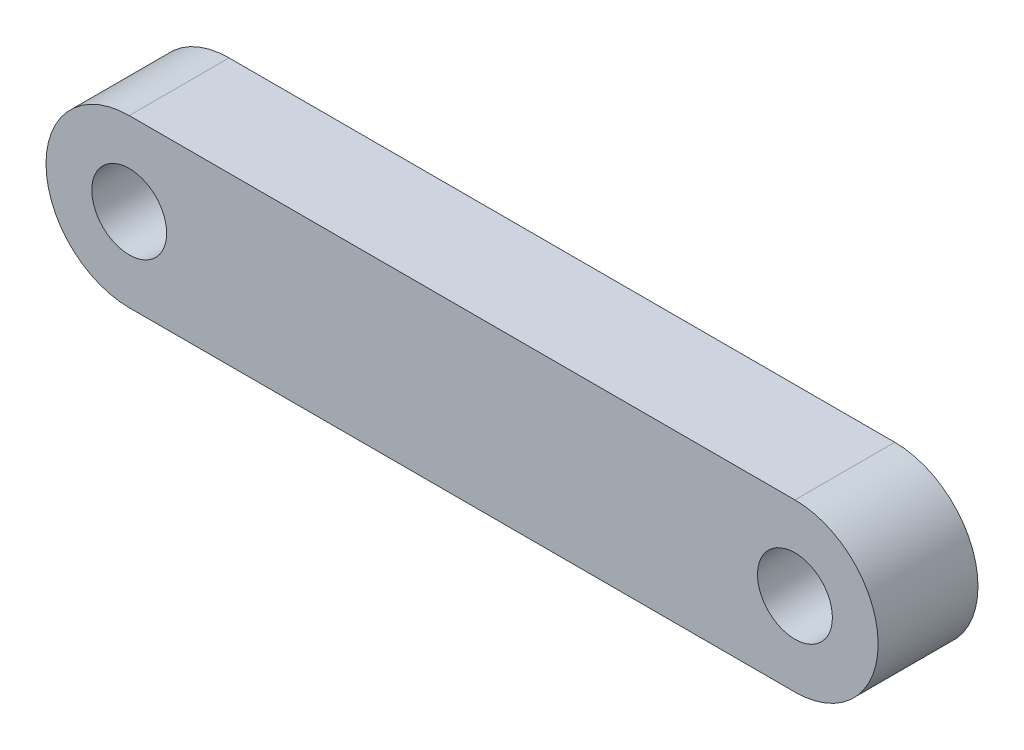
ISO-10303-21;
HEADER;
FILE_DESCRIPTION(('STEP AP214'),'2;1');
FILE_NAME('part.step','',(''),(''),'','','');
FILE_SCHEMA(('AUTOMOTIVE_DESIGN { 1 0 10303 214 1 1 1 1 }'));
ENDSEC;
DATA;
#1=APPLICATION_CONTEXT('core data for automotive mechanical design processes');
#2=APPLICATION_PROTOCOL_DEFINITION('international standard','automotive_design',2000,#1);
#3=PRODUCT_CONTEXT('',#1,'mechanical');
#4=PRODUCT('Part','Part','',(#3));
#5=PRODUCT_RELATED_PRODUCT_CATEGORY('part','',(#4));
#6=PRODUCT_DEFINITION_FORMATION('','',#4);
#7=PRODUCT_DEFINITION_CONTEXT('part definition',#1,'design');
#8=PRODUCT_DEFINITION('design','',#6,#7);
#9=PRODUCT_DEFINITION_SHAPE('','',#8);
#10=(LENGTH_UNIT() NAMED_UNIT(*) SI_UNIT(.MILLI.,.METRE.));
#11=(NAMED_UNIT(*) PLANE_ANGLE_UNIT() SI_UNIT($,.RADIAN.));
#12=(NAMED_UNIT(*) SI_UNIT($,.STERADIAN.) SOLID_ANGLE_UNIT());
#13=UNCERTAINTY_MEASURE_WITH_UNIT(LENGTH_MEASURE(1.E-05),#10,'distance_accuracy_value','');
#14=(GEOMETRIC_REPRESENTATION_CONTEXT(3) GLOBAL_UNCERTAINTY_ASSIGNED_CONTEXT((#13)) GLOBAL_UNIT_ASSIGNED_CONTEXT((#10,
#11,#12)) REPRESENTATION_CONTEXT('',''));
#15=CARTESIAN_POINT('',(0.,0.,0.));
#16=DIRECTION('',(0.,0.,1.));
#17=DIRECTION('',(1.,0.,0.));
#18=AXIS2_PLACEMENT_3D('',#15,#16,#17);
#19=CARTESIAN_POINT('',(0.,0.,6.));
#20=DIRECTION('',(0.,0.,1.));
#21=DIRECTION('',(1.,0.,0.));
#22=AXIS2_PLACEMENT_3D('',#19,#20,#21);
#23=PLANE('',#22);
#24=CARTESIAN_POINT('',(0.,0.,6.));
#25=DIRECTION('',(0.,0.,1.));
#26=DIRECTION('',(1.,0.,0.));
#27=AXIS2_PLACEMENT_3D('',#24,#25,#26);
#28=CIRCLE('',#27,2.25);
#29=CARTESIAN_POINT('',(2.25,0.,6.));
#30=VERTEX_POINT('',#29);
#31=EDGE_CURVE('E102',#30,#30,#28,.T.);
#32=ORIENTED_EDGE('',*,*,#31,.F.);
#33=EDGE_LOOP('',(#32));
#34=FACE_BOUND('',#33,.T.);
#35=CARTESIAN_POINT('',(0.,0.,6.));
#36=DIRECTION('',(0.,0.,1.));
#37=DIRECTION('',(1.,0.,0.));
#38=AXIS2_PLACEMENT_3D('',#35,#36,#37);
#39=CIRCLE('',#38,5.);
#40=CARTESIAN_POINT('',(0.,5.,6.));
#41=VERTEX_POINT('',#40);
#42=CARTESIAN_POINT('',(0.,-5.,6.));
#43=VERTEX_POINT('',#42);
#44=EDGE_CURVE('E87',#41,#43,#39,.T.);
#45=ORIENTED_EDGE('',*,*,#44,.T.);
#46=DIRECTION('',(1.,0.,0.));
#47=VECTOR('',#46,1.);
#48=CARTESIAN_POINT('',(0.,-5.,6.));
#49=LINE('',#48,#47);
#50=CARTESIAN_POINT('',(40.,-5.,6.));
#51=VERTEX_POINT('',#50);
#52=EDGE_CURVE('E82',#43,#51,#49,.T.);
#53=ORIENTED_EDGE('',*,*,#52,.T.);
#54=CARTESIAN_POINT('',(40.,0.,6.));
#55=DIRECTION('',(0.,0.,1.));
#56=DIRECTION('',(1.,0.,0.));
#57=AXIS2_PLACEMENT_3D('',#54,#55,#56);
#58=CIRCLE('',#57,5.);
#59=CARTESIAN_POINT('',(40.,5.,6.));
#60=VERTEX_POINT('',#59);
#61=EDGE_CURVE('E85',#51,#60,#58,.T.);
#62=ORIENTED_EDGE('',*,*,#61,.T.);
#63=DIRECTION('',(-1.,0.,0.));
#64=VECTOR('',#63,1.);
#65=CARTESIAN_POINT('',(0.,5.,6.));
#66=LINE('',#65,#64);
#67=EDGE_CURVE('E52',#60,#41,#66,.T.);
#68=ORIENTED_EDGE('',*,*,#67,.T.);
#69=EDGE_LOOP('',(#45,#53,#62,#68));
#70=FACE_BOUND('',#69,.T.);
#71=CARTESIAN_POINT('',(40.,0.,6.));
#72=DIRECTION('',(0.,0.,1.));
#73=DIRECTION('',(1.,0.,0.));
#74=AXIS2_PLACEMENT_3D('',#71,#72,#73);
#75=CIRCLE('',#74,2.25);
#76=CARTESIAN_POINT('',(42.25,0.,6.));
#77=VERTEX_POINT('',#76);
#78=EDGE_CURVE('E117',#77,#77,#75,.T.);
#79=ORIENTED_EDGE('',*,*,#78,.F.);
#80=EDGE_LOOP('',(#79));
#81=FACE_BOUND('',#80,.T.);
#82=ADVANCED_FACE('F35',(#34,#70,#81),#23,.T.);
#83=CARTESIAN_POINT('',(0.,0.,0.));
#84=DIRECTION('',(0.,0.,1.));
#85=DIRECTION('',(1.,0.,0.));
#86=AXIS2_PLACEMENT_3D('',#83,#84,#85);
#87=PLANE('',#86);
#88=CARTESIAN_POINT('',(0.,0.,0.));
#89=DIRECTION('',(0.,0.,1.));
#90=DIRECTION('',(1.,0.,0.));
#91=AXIS2_PLACEMENT_3D('',#88,#89,#90);
#92=CIRCLE('',#91,5.);
#93=CARTESIAN_POINT('',(0.,5.,0.));
#94=VERTEX_POINT('',#93);
#95=CARTESIAN_POINT('',(0.,-5.,0.));
#96=VERTEX_POINT('',#95);
#97=EDGE_CURVE('E99',#94,#96,#92,.T.);
#98=ORIENTED_EDGE('',*,*,#97,.F.);
#99=DIRECTION('',(-1.,0.,0.));
#100=VECTOR('',#99,1.);
#101=CARTESIAN_POINT('',(0.,5.,0.));
#102=LINE('',#101,#100);
#103=CARTESIAN_POINT('',(40.,5.,0.));
#104=VERTEX_POINT('',#103);
#105=EDGE_CURVE('E75',#104,#94,#102,.T.);
#106=ORIENTED_EDGE('',*,*,#105,.F.);
#107=CARTESIAN_POINT('',(40.,0.,0.));
#108=DIRECTION('',(0.,0.,1.));
#109=DIRECTION('',(1.,0.,0.));
#110=AXIS2_PLACEMENT_3D('',#107,#108,#109);
#111=CIRCLE('',#110,5.);
#112=CARTESIAN_POINT('',(40.,-5.,0.));
#113=VERTEX_POINT('',#112);
#114=EDGE_CURVE('E69',#113,#104,#111,.T.);
#115=ORIENTED_EDGE('',*,*,#114,.F.);
#116=DIRECTION('',(1.,0.,0.));
#117=VECTOR('',#116,1.);
#118=CARTESIAN_POINT('',(0.,-5.,0.));
#119=LINE('',#118,#117);
#120=EDGE_CURVE('E91',#96,#113,#119,.T.);
#121=ORIENTED_EDGE('',*,*,#120,.F.);
#122=EDGE_LOOP('',(#98,#106,#115,#121));
#123=FACE_BOUND('',#122,.T.);
#124=CARTESIAN_POINT('',(0.,0.,0.));
#125=DIRECTION('',(0.,0.,1.));
#126=DIRECTION('',(1.,0.,0.));
#127=AXIS2_PLACEMENT_3D('',#124,#125,#126);
#128=CIRCLE('',#127,2.25);
#129=CARTESIAN_POINT('',(2.25,0.,0.));
#130=VERTEX_POINT('',#129);
#131=EDGE_CURVE('E114',#130,#130,#128,.T.);
#132=ORIENTED_EDGE('',*,*,#131,.T.);
#133=EDGE_LOOP('',(#132));
#134=FACE_BOUND('',#133,.T.);
#135=CARTESIAN_POINT('',(40.,0.,0.));
#136=DIRECTION('',(0.,0.,1.));
#137=DIRECTION('',(1.,0.,0.));
#138=AXIS2_PLACEMENT_3D('',#135,#136,#137);
#139=CIRCLE('',#138,2.25);
#140=CARTESIAN_POINT('',(42.25,0.,0.));
#141=VERTEX_POINT('',#140);
#142=EDGE_CURVE('E120',#141,#141,#139,.T.);
#143=ORIENTED_EDGE('',*,*,#142,.T.);
#144=EDGE_LOOP('',(#143));
#145=FACE_BOUND('',#144,.T.);
#146=ADVANCED_FACE('F110',(#123,#134,#145),#87,.F.);
#147=CARTESIAN_POINT('',(0.,0.,6.));
#148=DIRECTION('',(0.,0.,-1.));
#149=DIRECTION('',(-1.,0.,0.));
#150=AXIS2_PLACEMENT_3D('',#147,#148,#149);
#151=CYLINDRICAL_SURFACE('',#150,5.);
#152=ORIENTED_EDGE('',*,*,#97,.T.);
#153=DIRECTION('',(0.,0.,-1.));
#154=VECTOR('',#153,1.);
#155=CARTESIAN_POINT('',(0.,-5.,6.));
#156=LINE('',#155,#154);
#157=EDGE_CURVE('E11',#43,#96,#156,.T.);
#158=ORIENTED_EDGE('',*,*,#157,.F.);
#159=ORIENTED_EDGE('',*,*,#44,.F.);
#160=DIRECTION('',(0.,0.,-1.));
#161=VECTOR('',#160,1.);
#162=CARTESIAN_POINT('',(0.,5.,6.));
#163=LINE('',#162,#161);
#164=EDGE_CURVE('E95',#41,#94,#163,.T.);
#165=ORIENTED_EDGE('',*,*,#164,.T.);
#166=EDGE_LOOP('',(#152,#158,#159,#165));
#167=FACE_BOUND('',#166,.T.);
#168=ADVANCED_FACE('F37',(#167),#151,.T.);
#169=CARTESIAN_POINT('',(0.,-5.,6.));
#170=DIRECTION('',(0.,1.,0.));
#171=DIRECTION('',(0.,0.,1.));
#172=AXIS2_PLACEMENT_3D('',#169,#170,#171);
#173=PLANE('',#172);
#174=ORIENTED_EDGE('',*,*,#120,.T.);
#175=DIRECTION('',(0.,0.,-1.));
#176=VECTOR('',#175,1.);
#177=CARTESIAN_POINT('',(40.,-5.,6.));
#178=LINE('',#177,#176);
#179=EDGE_CURVE('E44',#51,#113,#178,.T.);
#180=ORIENTED_EDGE('',*,*,#179,.F.);
#181=ORIENTED_EDGE('',*,*,#52,.F.);
#182=ORIENTED_EDGE('',*,*,#157,.T.);
#183=EDGE_LOOP('',(#174,#180,#181,#182));
#184=FACE_BOUND('',#183,.T.);
#185=ADVANCED_FACE('F90',(#184),#173,.F.);
#186=CARTESIAN_POINT('',(40.,0.,6.));
#187=DIRECTION('',(0.,0.,-1.));
#188=DIRECTION('',(-1.,0.,0.));
#189=AXIS2_PLACEMENT_3D('',#186,#187,#188);
#190=CYLINDRICAL_SURFACE('',#189,5.);
#191=ORIENTED_EDGE('',*,*,#114,.T.);
#192=DIRECTION('',(0.,0.,-1.));
#193=VECTOR('',#192,1.);
#194=CARTESIAN_POINT('',(40.,5.,6.));
#195=LINE('',#194,#193);
#196=EDGE_CURVE('E92',#60,#104,#195,.T.);
#197=ORIENTED_EDGE('',*,*,#196,.F.);
#198=ORIENTED_EDGE('',*,*,#61,.F.);
#199=ORIENTED_EDGE('',*,*,#179,.T.);
#200=EDGE_LOOP('',(#191,#197,#198,#199));
#201=FACE_BOUND('',#200,.T.);
#202=ADVANCED_FACE('F93',(#201),#190,.T.);
#203=CARTESIAN_POINT('',(0.,5.,6.));
#204=DIRECTION('',(0.,-1.,0.));
#205=DIRECTION('',(0.,0.,-1.));
#206=AXIS2_PLACEMENT_3D('',#203,#204,#205);
#207=PLANE('',#206);
#208=ORIENTED_EDGE('',*,*,#105,.T.);
#209=ORIENTED_EDGE('',*,*,#164,.F.);
#210=ORIENTED_EDGE('',*,*,#67,.F.);
#211=ORIENTED_EDGE('',*,*,#196,.T.);
#212=EDGE_LOOP('',(#208,#209,#210,#211));
#213=FACE_BOUND('',#212,.T.);
#214=ADVANCED_FACE('F107',(#213),#207,.F.);
#215=CARTESIAN_POINT('',(0.,0.,6.));
#216=DIRECTION('',(0.,0.,-1.));
#217=DIRECTION('',(-1.,0.,0.));
#218=AXIS2_PLACEMENT_3D('',#215,#216,#217);
#219=CYLINDRICAL_SURFACE('',#218,2.25);
#220=ORIENTED_EDGE('',*,*,#31,.T.);
#221=EDGE_LOOP('',(#220));
#222=FACE_BOUND('',#221,.T.);
#223=ORIENTED_EDGE('',*,*,#131,.F.);
#224=EDGE_LOOP('',(#223));
#225=FACE_BOUND('',#224,.T.);
#226=ADVANCED_FACE('F137',(#222,#225),#219,.F.);
#227=CARTESIAN_POINT('',(40.,0.,6.));
#228=DIRECTION('',(0.,0.,-1.));
#229=DIRECTION('',(-1.,0.,0.));
#230=AXIS2_PLACEMENT_3D('',#227,#228,#229);
#231=CYLINDRICAL_SURFACE('',#230,2.25);
#232=ORIENTED_EDGE('',*,*,#78,.T.);
#233=EDGE_LOOP('',(#232));
#234=FACE_BOUND('',#233,.T.);
#235=ORIENTED_EDGE('',*,*,#142,.F.);
#236=EDGE_LOOP('',(#235));
#237=FACE_BOUND('',#236,.T.);
#238=ADVANCED_FACE('F126',(#234,#237),#231,.F.);
#239=CLOSED_SHELL('',(#82,#146,#168,#185,#202,#214,#226,#238));
#240=MANIFOLD_SOLID_BREP('B2',#239);
#241=ADVANCED_BREP_SHAPE_REPRESENTATION('',(#18,#240),#14);
#242=SHAPE_DEFINITION_REPRESENTATION(#9,#241);
ENDSEC;
END-ISO-10303-21;
